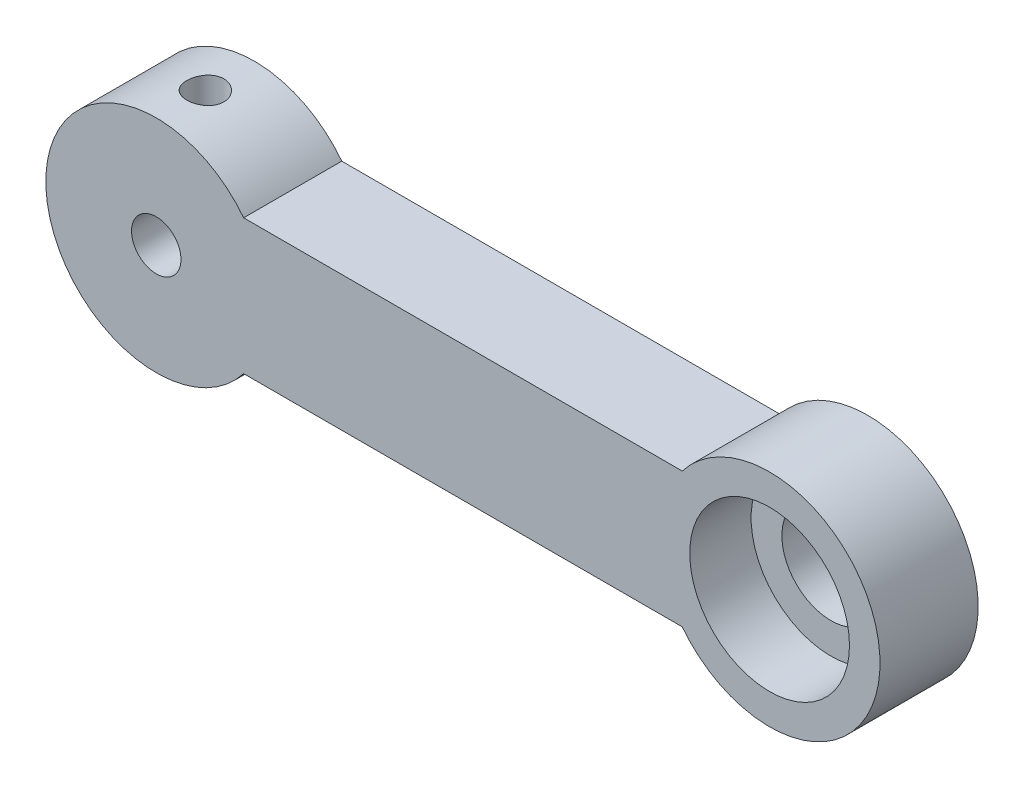
ISO-10303-21;
HEADER;
FILE_DESCRIPTION(('STEP AP214'),'2;1');
FILE_NAME('part.step','',(''),(''),'','','');
FILE_SCHEMA(('AUTOMOTIVE_DESIGN { 1 0 10303 214 1 1 1 1 }'));
ENDSEC;
DATA;
#1=APPLICATION_CONTEXT('core data for automotive mechanical design processes');
#2=APPLICATION_PROTOCOL_DEFINITION('international standard','automotive_design',2000,#1);
#3=PRODUCT_CONTEXT('',#1,'mechanical');
#4=PRODUCT('Part','Part','',(#3));
#5=PRODUCT_RELATED_PRODUCT_CATEGORY('part','',(#4));
#6=PRODUCT_DEFINITION_FORMATION('','',#4);
#7=PRODUCT_DEFINITION_CONTEXT('part definition',#1,'design');
#8=PRODUCT_DEFINITION('design','',#6,#7);
#9=PRODUCT_DEFINITION_SHAPE('','',#8);
#10=(LENGTH_UNIT() NAMED_UNIT(*) SI_UNIT(.MILLI.,.METRE.));
#11=(NAMED_UNIT(*) PLANE_ANGLE_UNIT() SI_UNIT($,.RADIAN.));
#12=(NAMED_UNIT(*) SI_UNIT($,.STERADIAN.) SOLID_ANGLE_UNIT());
#13=UNCERTAINTY_MEASURE_WITH_UNIT(LENGTH_MEASURE(1.E-05),#10,'distance_accuracy_value','');
#14=(GEOMETRIC_REPRESENTATION_CONTEXT(3) GLOBAL_UNCERTAINTY_ASSIGNED_CONTEXT((#13)) GLOBAL_UNIT_ASSIGNED_CONTEXT((#10,
#11,#12)) REPRESENTATION_CONTEXT('',''));
#15=CARTESIAN_POINT('',(0.,0.,0.));
#16=DIRECTION('',(0.,0.,1.));
#17=DIRECTION('',(1.,0.,0.));
#18=AXIS2_PLACEMENT_3D('',#15,#16,#17);
#19=CARTESIAN_POINT('',(47.1239034243875,5.5,0.));
#20=DIRECTION('',(0.,0.,1.));
#21=DIRECTION('',(1.,0.,0.));
#22=AXIS2_PLACEMENT_3D('',#19,#20,#21);
#23=CYLINDRICAL_SURFACE('',#22,4.);
#24=CARTESIAN_POINT('',(47.1239034243875,5.5,0.));
#25=DIRECTION('',(0.,0.,1.));
#26=DIRECTION('',(1.,0.,0.));
#27=AXIS2_PLACEMENT_3D('',#24,#25,#26);
#28=CIRCLE('',#27,4.);
#29=CARTESIAN_POINT('',(51.1239034243875,5.5,0.));
#30=VERTEX_POINT('',#29);
#31=EDGE_CURVE('E114',#30,#30,#28,.T.);
#32=ORIENTED_EDGE('',*,*,#31,.F.);
#33=EDGE_LOOP('',(#32));
#34=FACE_BOUND('',#33,.T.);
#35=CARTESIAN_POINT('',(47.1239034243875,5.5,3.));
#36=DIRECTION('',(0.,0.,1.));
#37=DIRECTION('',(1.,0.,0.));
#38=AXIS2_PLACEMENT_3D('',#35,#36,#37);
#39=CIRCLE('',#38,4.);
#40=CARTESIAN_POINT('',(51.1239034243875,5.5,3.));
#41=VERTEX_POINT('',#40);
#42=EDGE_CURVE('E112',#41,#41,#39,.F.);
#43=ORIENTED_EDGE('',*,*,#42,.F.);
#44=EDGE_LOOP('',(#43));
#45=FACE_BOUND('',#44,.T.);
#46=ADVANCED_FACE('F34',(#34,#45),#23,.F.);
#47=CARTESIAN_POINT('',(0.,0.,8.));
#48=DIRECTION('',(0.,1.,0.));
#49=DIRECTION('',(0.,0.,1.));
#50=AXIS2_PLACEMENT_3D('',#47,#48,#49);
#51=PLANE('',#50);
#52=DIRECTION('',(1.,0.,0.));
#53=VECTOR('',#52,1.);
#54=CARTESIAN_POINT('',(0.,0.,8.));
#55=LINE('',#54,#53);
#56=CARTESIAN_POINT('',(4.24780684877501,0.,8.));
#57=VERTEX_POINT('',#56);
#58=CARTESIAN_POINT('',(40.,0.,8.));
#59=VERTEX_POINT('',#58);
#60=EDGE_CURVE('E103',#57,#59,#55,.T.);
#61=ORIENTED_EDGE('',*,*,#60,.F.);
#62=DIRECTION('',(0.,0.,1.));
#63=VECTOR('',#62,1.);
#64=CARTESIAN_POINT('',(4.24780684877501,0.,0.));
#65=LINE('',#64,#63);
#66=CARTESIAN_POINT('',(4.24780684877501,0.,0.));
#67=VERTEX_POINT('',#66);
#68=EDGE_CURVE('E76',#57,#67,#65,.F.);
#69=ORIENTED_EDGE('',*,*,#68,.T.);
#70=DIRECTION('',(1.,0.,0.));
#71=VECTOR('',#70,1.);
#72=CARTESIAN_POINT('',(0.,0.,0.));
#73=LINE('',#72,#71);
#74=CARTESIAN_POINT('',(40.,0.,0.));
#75=VERTEX_POINT('',#74);
#76=EDGE_CURVE('E69',#67,#75,#73,.T.);
#77=ORIENTED_EDGE('',*,*,#76,.T.);
#78=DIRECTION('',(0.,0.,-1.));
#79=VECTOR('',#78,1.);
#80=CARTESIAN_POINT('',(40.,0.,8.));
#81=LINE('',#80,#79);
#82=EDGE_CURVE('E11',#59,#75,#81,.T.);
#83=ORIENTED_EDGE('',*,*,#82,.F.);
#84=EDGE_LOOP('',(#61,#69,#77,#83));
#85=FACE_BOUND('',#84,.T.);
#86=ADVANCED_FACE('F36',(#85),#51,.F.);
#87=CARTESIAN_POINT('',(47.1239034243875,5.5,8.));
#88=DIRECTION('',(0.,0.,-1.));
#89=DIRECTION('',(-1.,0.,0.));
#90=AXIS2_PLACEMENT_3D('',#87,#88,#89);
#91=CYLINDRICAL_SURFACE('',#90,9.);
#92=CARTESIAN_POINT('',(47.1239034243875,5.5,0.));
#93=DIRECTION('',(0.,0.,1.));
#94=DIRECTION('',(-1.,0.,0.));
#95=AXIS2_PLACEMENT_3D('',#92,#93,#94);
#96=CIRCLE('',#95,9.);
#97=CARTESIAN_POINT('',(40.,11.,0.));
#98=VERTEX_POINT('',#97);
#99=EDGE_CURVE('E104',#75,#98,#96,.T.);
#100=ORIENTED_EDGE('',*,*,#99,.T.);
#101=DIRECTION('',(0.,0.,-1.));
#102=VECTOR('',#101,1.);
#103=CARTESIAN_POINT('',(40.,11.,8.));
#104=LINE('',#103,#102);
#105=CARTESIAN_POINT('',(40.,11.,8.));
#106=VERTEX_POINT('',#105);
#107=EDGE_CURVE('E49',#106,#98,#104,.T.);
#108=ORIENTED_EDGE('',*,*,#107,.F.);
#109=CARTESIAN_POINT('',(47.1239034243875,5.5,8.));
#110=DIRECTION('',(0.,0.,1.));
#111=DIRECTION('',(-1.,0.,0.));
#112=AXIS2_PLACEMENT_3D('',#109,#110,#111);
#113=CIRCLE('',#112,9.);
#114=EDGE_CURVE('E58',#59,#106,#113,.T.);
#115=ORIENTED_EDGE('',*,*,#114,.F.);
#116=ORIENTED_EDGE('',*,*,#82,.T.);
#117=EDGE_LOOP('',(#100,#108,#115,#116));
#118=FACE_BOUND('',#117,.T.);
#119=ADVANCED_FACE('F168',(#118),#91,.T.);
#120=CARTESIAN_POINT('',(0.,11.,8.));
#121=DIRECTION('',(0.,-1.,0.));
#122=DIRECTION('',(0.,0.,-1.));
#123=AXIS2_PLACEMENT_3D('',#120,#121,#122);
#124=PLANE('',#123);
#125=DIRECTION('',(-1.,0.,0.));
#126=VECTOR('',#125,1.);
#127=CARTESIAN_POINT('',(0.,11.,0.));
#128=LINE('',#127,#126);
#129=CARTESIAN_POINT('',(4.24780684877501,11.,0.));
#130=VERTEX_POINT('',#129);
#131=EDGE_CURVE('E99',#98,#130,#128,.T.);
#132=ORIENTED_EDGE('',*,*,#131,.T.);
#133=DIRECTION('',(0.,0.,1.));
#134=VECTOR('',#133,1.);
#135=CARTESIAN_POINT('',(4.24780684877501,11.,0.));
#136=LINE('',#135,#134);
#137=CARTESIAN_POINT('',(4.24780684877501,11.,8.));
#138=VERTEX_POINT('',#137);
#139=EDGE_CURVE('E85',#130,#138,#136,.T.);
#140=ORIENTED_EDGE('',*,*,#139,.T.);
#141=DIRECTION('',(-1.,0.,0.));
#142=VECTOR('',#141,1.);
#143=CARTESIAN_POINT('',(0.,11.,8.));
#144=LINE('',#143,#142);
#145=EDGE_CURVE('E110',#106,#138,#144,.T.);
#146=ORIENTED_EDGE('',*,*,#145,.F.);
#147=ORIENTED_EDGE('',*,*,#107,.T.);
#148=EDGE_LOOP('',(#132,#140,#146,#147));
#149=FACE_BOUND('',#148,.T.);
#150=ADVANCED_FACE('F102',(#149),#124,.F.);
#151=CARTESIAN_POINT('',(47.1239034243875,5.5,8.));
#152=DIRECTION('',(0.,0.,-1.));
#153=DIRECTION('',(-1.,0.,0.));
#154=AXIS2_PLACEMENT_3D('',#151,#152,#153);
#155=PLANE('',#154);
#156=CARTESIAN_POINT('',(-2.8760965756125,5.5,8.));
#157=DIRECTION('',(0.,0.,1.));
#158=DIRECTION('',(1.,0.,0.));
#159=AXIS2_PLACEMENT_3D('',#156,#157,#158);
#160=CIRCLE('',#159,2.015);
#161=CARTESIAN_POINT('',(-0.861096575612496,5.5,8.));
#162=VERTEX_POINT('',#161);
#163=EDGE_CURVE('E179',#162,#162,#160,.T.);
#164=ORIENTED_EDGE('',*,*,#163,.F.);
#165=EDGE_LOOP('',(#164));
#166=FACE_BOUND('',#165,.T.);
#167=CARTESIAN_POINT('',(-2.8760965756125,5.5,8.));
#168=DIRECTION('',(0.,0.,1.));
#169=DIRECTION('',(1.,0.,0.));
#170=AXIS2_PLACEMENT_3D('',#167,#168,#169);
#171=CIRCLE('',#170,9.);
#172=EDGE_CURVE('E89',#138,#57,#171,.T.);
#173=ORIENTED_EDGE('',*,*,#172,.T.);
#174=ORIENTED_EDGE('',*,*,#60,.T.);
#175=ORIENTED_EDGE('',*,*,#114,.T.);
#176=ORIENTED_EDGE('',*,*,#145,.T.);
#177=EDGE_LOOP('',(#173,#174,#175,#176));
#178=FACE_BOUND('',#177,.T.);
#179=CARTESIAN_POINT('',(47.1239034243875,5.5,8.));
#180=DIRECTION('',(0.,0.,1.));
#181=DIRECTION('',(1.,0.,0.));
#182=AXIS2_PLACEMENT_3D('',#179,#180,#181);
#183=CIRCLE('',#182,6.50999999999999);
#184=CARTESIAN_POINT('',(53.6339034243875,5.5,8.));
#185=VERTEX_POINT('',#184);
#186=EDGE_CURVE('E183',#185,#185,#183,.T.);
#187=ORIENTED_EDGE('',*,*,#186,.F.);
#188=EDGE_LOOP('',(#187));
#189=FACE_BOUND('',#188,.T.);
#190=ADVANCED_FACE('F160',(#166,#178,#189),#155,.F.);
#191=CARTESIAN_POINT('',(47.1239034243875,5.5,0.));
#192=DIRECTION('',(0.,0.,-1.));
#193=DIRECTION('',(-1.,0.,0.));
#194=AXIS2_PLACEMENT_3D('',#191,#192,#193);
#195=PLANE('',#194);
#196=CARTESIAN_POINT('',(-2.8760965756125,5.5,0.));
#197=DIRECTION('',(0.,0.,1.));
#198=DIRECTION('',(1.,0.,0.));
#199=AXIS2_PLACEMENT_3D('',#196,#197,#198);
#200=CIRCLE('',#199,2.015);
#201=CARTESIAN_POINT('',(-0.861096575612496,5.5,0.));
#202=VERTEX_POINT('',#201);
#203=EDGE_CURVE('E176',#202,#202,#200,.T.);
#204=ORIENTED_EDGE('',*,*,#203,.T.);
#205=EDGE_LOOP('',(#204));
#206=FACE_BOUND('',#205,.T.);
#207=ORIENTED_EDGE('',*,*,#76,.F.);
#208=CARTESIAN_POINT('',(-2.8760965756125,5.5,0.));
#209=DIRECTION('',(0.,0.,1.));
#210=DIRECTION('',(1.,0.,0.));
#211=AXIS2_PLACEMENT_3D('',#208,#209,#210);
#212=CIRCLE('',#211,9.);
#213=EDGE_CURVE('E88',#130,#67,#212,.T.);
#214=ORIENTED_EDGE('',*,*,#213,.F.);
#215=ORIENTED_EDGE('',*,*,#131,.F.);
#216=ORIENTED_EDGE('',*,*,#99,.F.);
#217=EDGE_LOOP('',(#207,#214,#215,#216));
#218=FACE_BOUND('',#217,.T.);
#219=ORIENTED_EDGE('',*,*,#31,.T.);
#220=EDGE_LOOP('',(#219));
#221=FACE_BOUND('',#220,.T.);
#222=ADVANCED_FACE('F96',(#206,#218,#221),#195,.T.);
#223=CARTESIAN_POINT('',(47.1239034243875,5.5,3.));
#224=DIRECTION('',(0.,0.,1.));
#225=DIRECTION('',(1.,0.,0.));
#226=AXIS2_PLACEMENT_3D('',#223,#224,#225);
#227=PLANE('',#226);
#228=CARTESIAN_POINT('',(47.1239034243875,5.5,3.));
#229=DIRECTION('',(0.,0.,1.));
#230=DIRECTION('',(1.,0.,0.));
#231=AXIS2_PLACEMENT_3D('',#228,#229,#230);
#232=CIRCLE('',#231,6.50999999999999);
#233=CARTESIAN_POINT('',(53.6339034243875,5.5,3.));
#234=VERTEX_POINT('',#233);
#235=EDGE_CURVE('E115',#234,#234,#232,.T.);
#236=ORIENTED_EDGE('',*,*,#235,.T.);
#237=EDGE_LOOP('',(#236));
#238=FACE_BOUND('',#237,.T.);
#239=ORIENTED_EDGE('',*,*,#42,.T.);
#240=EDGE_LOOP('',(#239));
#241=FACE_BOUND('',#240,.T.);
#242=ADVANCED_FACE('F149',(#238,#241),#227,.T.);
#243=CARTESIAN_POINT('',(47.1239034243875,5.5,3.));
#244=DIRECTION('',(0.,0.,1.));
#245=DIRECTION('',(1.,0.,0.));
#246=AXIS2_PLACEMENT_3D('',#243,#244,#245);
#247=CYLINDRICAL_SURFACE('',#246,6.50999999999999);
#248=ORIENTED_EDGE('',*,*,#235,.F.);
#249=EDGE_LOOP('',(#248));
#250=FACE_BOUND('',#249,.T.);
#251=ORIENTED_EDGE('',*,*,#186,.T.);
#252=EDGE_LOOP('',(#251));
#253=FACE_BOUND('',#252,.T.);
#254=ADVANCED_FACE('F147',(#250,#253),#247,.F.);
#255=CARTESIAN_POINT('',(-2.8760965756125,5.5,0.));
#256=DIRECTION('',(0.,0.,1.));
#257=DIRECTION('',(1.,0.,0.));
#258=AXIS2_PLACEMENT_3D('',#255,#256,#257);
#259=CYLINDRICAL_SURFACE('',#258,9.);
#260=CARTESIAN_POINT('',(-2.8760965756125,-3.5,5.51));
#261=CARTESIAN_POINT('',(-2.96028040690752,-3.49999855218498,5.50999663191623));
#262=CARTESIAN_POINT('',(-3.04450997600634,-3.49880654936634,5.50293623397101));
#263=CARTESIAN_POINT('',(-3.21060617309282,-3.49416620365112,5.47489325685609));
#264=CARTESIAN_POINT('',(-3.29247056552096,-3.49071579456022,5.45389792850471));
#265=CARTESIAN_POINT('',(-3.45140935547466,-3.4819455929922,5.39863732254473));
#266=CARTESIAN_POINT('',(-3.5284876316704,-3.47662733811376,5.36438295732929));
#267=CARTESIAN_POINT('',(-3.67579299659992,-3.46470600022673,5.28360532789586));
#268=CARTESIAN_POINT('',(-3.74602085601205,-3.4581030619971,5.23708344597088));
#269=CARTESIAN_POINT('',(-3.87832154933646,-3.44427269148449,5.13261224998846));
#270=CARTESIAN_POINT('',(-3.94031843210536,-3.4370403429084,5.07456739321781));
#271=CARTESIAN_POINT('',(-4.05374118942527,-3.422803853935,4.94890356762904));
#272=CARTESIAN_POINT('',(-4.10516639221043,-3.41579972806365,4.88128399085659));
#273=CARTESIAN_POINT('',(-4.19629097049418,-3.40276508956071,4.73786771533586));
#274=CARTESIAN_POINT('',(-4.23591513340478,-3.39674092852148,4.66202259995039));
#275=CARTESIAN_POINT('',(-4.30183184754516,-3.38641654901985,4.50463495986804));
#276=CARTESIAN_POINT('',(-4.32812531168406,-3.38211621251121,4.42309282574801));
#277=CARTESIAN_POINT('',(-4.36639473171205,-3.37577534084285,4.25743130673641));
#278=CARTESIAN_POINT('',(-4.37850187787853,-3.3737141123528,4.17334303514304));
#279=CARTESIAN_POINT('',(-4.38846176312593,-3.37202224638639,4.00430519619741));
#280=CARTESIAN_POINT('',(-4.38631552447238,-3.37239143459835,3.91935569104991));
#281=CARTESIAN_POINT('',(-4.36793639837256,-3.37549979815238,3.75194400042342));
#282=CARTESIAN_POINT('',(-4.35185097575971,-3.37821416260982,3.66946509789419));
#283=CARTESIAN_POINT('',(-4.30628155191977,-3.38566819322774,3.50839358796051));
#284=CARTESIAN_POINT('',(-4.276797085552,-3.39040792969757,3.42980111557645));
#285=CARTESIAN_POINT('',(-4.20511728957096,-3.40140541255161,3.27829245981058));
#286=CARTESIAN_POINT('',(-4.16286081039339,-3.40767043294621,3.20540575641593));
#287=CARTESIAN_POINT('',(-4.06687990235038,-3.42100753497343,3.06770163528141));
#288=CARTESIAN_POINT('',(-4.01315453579976,-3.42807968257399,3.00288487801899));
#289=CARTESIAN_POINT('',(-3.89495788250733,-3.44234315682377,2.88230704395312));
#290=CARTESIAN_POINT('',(-3.8303600927499,-3.44953486464518,2.82666994252046));
#291=CARTESIAN_POINT('',(-3.69267989849588,-3.46314504293981,2.72700598467358));
#292=CARTESIAN_POINT('',(-3.61959743797023,-3.4695635083063,2.68297920493515));
#293=CARTESIAN_POINT('',(-3.46690523254514,-3.4809133126244,2.60777401586093));
#294=CARTESIAN_POINT('',(-3.38728994414748,-3.48584337162453,2.57660665655734));
#295=CARTESIAN_POINT('',(-3.22385360633593,-3.49365062052748,2.52812060812794));
#296=CARTESIAN_POINT('',(-3.14003291416142,-3.49652798448708,2.51080074479884));
#297=CARTESIAN_POINT('',(-2.97163358456211,-3.4998822115326,2.49066962673628));
#298=CARTESIAN_POINT('',(-2.88707583193853,-3.50038722922228,2.48768819575929));
#299=CARTESIAN_POINT('',(-2.71866906280707,-3.49901700836876,2.49586473720778));
#300=CARTESIAN_POINT('',(-2.63482001878016,-3.49714186267835,2.50702215806117));
#301=CARTESIAN_POINT('',(-2.47073718888595,-3.49123944723341,2.54301814534468));
#302=CARTESIAN_POINT('',(-2.39048438099822,-3.48722544994186,2.56777236686523));
#303=CARTESIAN_POINT('',(-2.23526789491027,-3.47749361149574,2.63016929067711));
#304=CARTESIAN_POINT('',(-2.16030451730714,-3.47177567360291,2.66781272474904));
#305=CARTESIAN_POINT('',(-2.01705629457658,-3.45920041893288,2.75530860845832));
#306=CARTESIAN_POINT('',(-1.94883717770084,-3.45233336911958,2.80526724244356));
#307=CARTESIAN_POINT('',(-1.82169009526839,-3.43825075635745,2.91582943641656));
#308=CARTESIAN_POINT('',(-1.76276281478915,-3.4310351677624,2.97643378060577));
#309=CARTESIAN_POINT('',(-1.65524052543818,-3.41697756225923,3.10733066728689));
#310=CARTESIAN_POINT('',(-1.60676055538153,-3.41014026578846,3.17771829294824));
#311=CARTESIAN_POINT('',(-1.52231275614601,-3.39770189190615,3.32573825407895));
#312=CARTESIAN_POINT('',(-1.48634452651698,-3.3921007749316,3.40337035758103));
#313=CARTESIAN_POINT('',(-1.42811281470965,-3.3828044410498,3.56335542604624));
#314=CARTESIAN_POINT('',(-1.40579230191997,-3.37910130358221,3.64568715180104));
#315=CARTESIAN_POINT('',(-1.37531032750289,-3.37400042905291,3.81299860350929));
#316=CARTESIAN_POINT('',(-1.36714761681589,-3.37260248861777,3.89797809519249));
#317=CARTESIAN_POINT('',(-1.36524814443519,-3.37227913249936,4.06702390275659));
#318=CARTESIAN_POINT('',(-1.3713302874316,-3.37332267794466,4.15108817922104));
#319=CARTESIAN_POINT('',(-1.39735603791239,-3.37769664587433,4.31697914491591));
#320=CARTESIAN_POINT('',(-1.41729959872844,-3.3810270606593,4.39880584167881));
#321=CARTESIAN_POINT('',(-1.47041232278205,-3.38958765295106,4.55782746974423));
#322=CARTESIAN_POINT('',(-1.50356569012189,-3.3948155608288,4.63502780672988));
#323=CARTESIAN_POINT('',(-1.58213826198711,-3.40658425377943,4.78279988065248));
#324=CARTESIAN_POINT('',(-1.62755808820679,-3.41312510539123,4.85337128137422));
#325=CARTESIAN_POINT('',(-1.73001973873243,-3.42688099470917,4.98679677043307));
#326=CARTESIAN_POINT('',(-1.78719472112584,-3.4341031922828,5.04954787908375));
#327=CARTESIAN_POINT('',(-1.9112630833793,-3.44835108899346,5.16462716497614));
#328=CARTESIAN_POINT('',(-1.97815870215674,-3.45537674241544,5.21695293438751));
#329=CARTESIAN_POINT('',(-2.12032684002082,-3.46849703889302,5.31003173497558));
#330=CARTESIAN_POINT('',(-2.19565477746841,-3.47458481260152,5.35070109718076));
#331=CARTESIAN_POINT('',(-2.35214504891661,-3.48507656422292,5.41874591280365));
#332=CARTESIAN_POINT('',(-2.43330149633898,-3.48948221337872,5.44613456836016));
#333=CARTESIAN_POINT('',(-2.57499072999182,-3.49515508831471,5.48091509482011));
#334=CARTESIAN_POINT('',(-2.63466774940342,-3.4969621913707,5.49180440771002));
#335=CARTESIAN_POINT('',(-2.75492081476759,-3.4993851578433,5.50634800893813));
#336=CARTESIAN_POINT('',(-2.81549684489056,-3.50000104220964,5.51000242451509));
#337=CARTESIAN_POINT('',(-2.8760965756125,-3.5,5.51));
#338=B_SPLINE_CURVE_WITH_KNOTS('',3,(#260,#261,#262,#263,#264,#265,#266,#267,#268,#269,#270,
#271,#272,#273,#274,#275,#276,#277,#278,#279,#280,#281,#282,#283,#284,#285,#286,#287,#288,#289,
#290,#291,#292,#293,#294,#295,#296,#297,#298,#299,#300,#301,#302,#303,#304,#305,#306,#307,#308,
#309,#310,#311,#312,#313,#314,#315,#316,#317,#318,#319,#320,#321,#322,#323,#324,#325,#326,#327,
#328,#329,#330,#331,#332,#333,#334,#335,#336,#337),.UNSPECIFIED.,.T.,.F.,(4,2,2,2,2,2,2,2,2,2,2,
2,2,2,2,2,2,2,2,2,2,2,2,2,2,2,2,2,2,2,2,2,2,2,2,2,2,2,4),(0.,0.252329978845575,
0.504891135268154,0.757244870392844,1.00957018266176,1.26408229715819,1.51861057935301,
1.77472796287162,2.03082780466287,2.28454014742669,2.53823429391067,2.78927688813311,
3.04032819783142,3.29260105521894,3.54489454609687,3.80035710173568,4.05582134443396,
4.31150465130647,4.56716627512321,4.81978595242411,5.07239577505792,5.32345599847534,
5.57453047811445,5.82785052881584,6.08118924781839,6.33718918891409,6.59318093573418,
6.8480955087645,7.1029875910375,7.35465684310833,7.60632524786844,7.8576936137854,
8.10907472206119,8.36347800289646,8.61793997262826,8.87418515798765,9.13017508919799,
9.3118180183109,9.49345775287616),.UNSPECIFIED.);
#339=CARTESIAN_POINT('',(-2.8760965756125,-3.5,5.51));
#340=VERTEX_POINT('',#339);
#341=EDGE_CURVE('E139',#340,#340,#338,.T.);
#342=ORIENTED_EDGE('',*,*,#341,.F.);
#343=EDGE_LOOP('',(#342));
#344=FACE_BOUND('',#343,.T.);
#345=CARTESIAN_POINT('',(-2.8760965756125,14.5,5.51));
#346=CARTESIAN_POINT('',(-2.79191274431748,14.499998552185,5.50999663191623));
#347=CARTESIAN_POINT('',(-2.70768317521865,14.4988065493663,5.50293623397101));
#348=CARTESIAN_POINT('',(-2.54158697813218,14.4941662036511,5.47489325685609));
#349=CARTESIAN_POINT('',(-2.45972258570404,14.4907157945602,5.45389792850471));
#350=CARTESIAN_POINT('',(-2.30078379575033,14.4819455929922,5.39863732254473));
#351=CARTESIAN_POINT('',(-2.22370551955459,14.4766273381138,5.36438295732929));
#352=CARTESIAN_POINT('',(-2.07640015462508,14.4647060002267,5.28360532789586));
#353=CARTESIAN_POINT('',(-2.00617229521294,14.4581030619971,5.23708344597088));
#354=CARTESIAN_POINT('',(-1.87387160188853,14.4442726914845,5.13261224998846));
#355=CARTESIAN_POINT('',(-1.81187471911963,14.4370403429084,5.07456739321781));
#356=CARTESIAN_POINT('',(-1.69845196179973,14.422803853935,4.94890356762904));
#357=CARTESIAN_POINT('',(-1.64702675901457,14.4157997280636,4.88128399085659));
#358=CARTESIAN_POINT('',(-1.55590218073081,14.4027650895607,4.73786771533586));
#359=CARTESIAN_POINT('',(-1.51627801782022,14.3967409285215,4.66202259995039));
#360=CARTESIAN_POINT('',(-1.45036130367983,14.3864165490198,4.50463495986803));
#361=CARTESIAN_POINT('',(-1.42406783954094,14.3821162125112,4.42309282574801));
#362=CARTESIAN_POINT('',(-1.38579841951294,14.3757753408429,4.25743130673641));
#363=CARTESIAN_POINT('',(-1.37369127334647,14.3737141123528,4.17334303514304));
#364=CARTESIAN_POINT('',(-1.36373138809906,14.3720222463864,4.00430519619741));
#365=CARTESIAN_POINT('',(-1.36587762675262,14.3723914345983,3.91935569104991));
#366=CARTESIAN_POINT('',(-1.38425675285244,14.3754997981524,3.75194400042342));
#367=CARTESIAN_POINT('',(-1.40034217546528,14.3782141626098,3.66946509789419));
#368=CARTESIAN_POINT('',(-1.44591159930522,14.3856681932277,3.50839358796051));
#369=CARTESIAN_POINT('',(-1.475396065673,14.3904079296976,3.42980111557645));
#370=CARTESIAN_POINT('',(-1.54707586165403,14.4014054125516,3.27829245981058));
#371=CARTESIAN_POINT('',(-1.5893323408316,14.4076704329462,3.20540575641593));
#372=CARTESIAN_POINT('',(-1.68531324887462,14.4210075349734,3.06770163528141));
#373=CARTESIAN_POINT('',(-1.73903861542524,14.428079682574,3.00288487801899));
#374=CARTESIAN_POINT('',(-1.85723526871766,14.4423431568238,2.88230704395312));
#375=CARTESIAN_POINT('',(-1.92183305847509,14.4495348646452,2.82666994252046));
#376=CARTESIAN_POINT('',(-2.05951325272911,14.4631450429398,2.72700598467358));
#377=CARTESIAN_POINT('',(-2.13259571325477,14.4695635083063,2.68297920493515));
#378=CARTESIAN_POINT('',(-2.28528791867985,14.4809133126244,2.60777401586093));
#379=CARTESIAN_POINT('',(-2.36490320707751,14.4858433716245,2.57660665655734));
#380=CARTESIAN_POINT('',(-2.52833954488907,14.4936506205275,2.52812060812794));
#381=CARTESIAN_POINT('',(-2.61216023706357,14.4965279844871,2.51080074479884));
#382=CARTESIAN_POINT('',(-2.78055956666288,14.4998822115326,2.49066962673628));
#383=CARTESIAN_POINT('',(-2.86511731928647,14.5003872292223,2.48768819575929));
#384=CARTESIAN_POINT('',(-3.03352408841792,14.4990170083688,2.49586473720778));
#385=CARTESIAN_POINT('',(-3.11737313244483,14.4971418626783,2.50702215806117));
#386=CARTESIAN_POINT('',(-3.28145596233904,14.4912394472334,2.54301814534468));
#387=CARTESIAN_POINT('',(-3.36170877022677,14.4872254499419,2.56777236686523));
#388=CARTESIAN_POINT('',(-3.51692525631472,14.4774936114957,2.63016929067711));
#389=CARTESIAN_POINT('',(-3.59188863391786,14.4717756736029,2.66781272474904));
#390=CARTESIAN_POINT('',(-3.73513685664842,14.4592004189329,2.75530860845832));
#391=CARTESIAN_POINT('',(-3.80335597352415,14.4523333691196,2.80526724244356));
#392=CARTESIAN_POINT('',(-3.93050305595661,14.4382507563574,2.91582943641656));
#393=CARTESIAN_POINT('',(-3.98943033643584,14.4310351677624,2.97643378060577));
#394=CARTESIAN_POINT('',(-4.09695262578682,14.4169775622592,3.1073306672869));
#395=CARTESIAN_POINT('',(-4.14543259584346,14.4101402657885,3.17771829294824));
#396=CARTESIAN_POINT('',(-4.22988039507899,14.3977018919061,3.32573825407895));
#397=CARTESIAN_POINT('',(-4.26584862470802,14.3921007749316,3.40337035758103));
#398=CARTESIAN_POINT('',(-4.32408033651535,14.3828044410498,3.56335542604624));
#399=CARTESIAN_POINT('',(-4.34640084930502,14.3791013035822,3.64568715180104));
#400=CARTESIAN_POINT('',(-4.3768828237221,14.3740004290529,3.81299860350929));
#401=CARTESIAN_POINT('',(-4.3850455344091,14.3726024886178,3.89797809519249));
#402=CARTESIAN_POINT('',(-4.38694500678981,14.3722791324994,4.06702390275659));
#403=CARTESIAN_POINT('',(-4.38086286379339,14.3733226779447,4.15108817922104));
#404=CARTESIAN_POINT('',(-4.3548371133126,14.3776966458743,4.31697914491591));
#405=CARTESIAN_POINT('',(-4.33489355249656,14.3810270606593,4.39880584167881));
#406=CARTESIAN_POINT('',(-4.28178082844294,14.3895876529511,4.55782746974423));
#407=CARTESIAN_POINT('',(-4.2486274611031,14.3948155608288,4.63502780672988));
#408=CARTESIAN_POINT('',(-4.17005488923789,14.4065842537794,4.78279988065248));
#409=CARTESIAN_POINT('',(-4.1246350630182,14.4131251053912,4.85337128137422));
#410=CARTESIAN_POINT('',(-4.02217341249256,14.4268809947092,4.98679677043307));
#411=CARTESIAN_POINT('',(-3.96499843009915,14.4341031922828,5.04954787908375));
#412=CARTESIAN_POINT('',(-3.84093006784569,14.4483510889935,5.16462716497614));
#413=CARTESIAN_POINT('',(-3.77403444906825,14.4553767424154,5.21695293438751));
#414=CARTESIAN_POINT('',(-3.63186631120417,14.468497038893,5.31003173497558));
#415=CARTESIAN_POINT('',(-3.55653837375658,14.4745848126015,5.35070109718076));
#416=CARTESIAN_POINT('',(-3.40004810230838,14.4850765642229,5.41874591280365));
#417=CARTESIAN_POINT('',(-3.31889165488601,14.4894822133787,5.44613456836016));
#418=CARTESIAN_POINT('',(-3.17720242123318,14.4951550883147,5.48091509482011));
#419=CARTESIAN_POINT('',(-3.11752540182158,14.4969621913707,5.49180440771002));
#420=CARTESIAN_POINT('',(-2.99727233645741,14.4993851578433,5.50634800893813));
#421=CARTESIAN_POINT('',(-2.93669630633444,14.5000010422096,5.51000242451509));
#422=CARTESIAN_POINT('',(-2.8760965756125,14.5,5.51));
#423=B_SPLINE_CURVE_WITH_KNOTS('',3,(#345,#346,#347,#348,#349,#350,#351,#352,#353,#354,#355,
#356,#357,#358,#359,#360,#361,#362,#363,#364,#365,#366,#367,#368,#369,#370,#371,#372,#373,#374,
#375,#376,#377,#378,#379,#380,#381,#382,#383,#384,#385,#386,#387,#388,#389,#390,#391,#392,#393,
#394,#395,#396,#397,#398,#399,#400,#401,#402,#403,#404,#405,#406,#407,#408,#409,#410,#411,#412,
#413,#414,#415,#416,#417,#418,#419,#420,#421,#422),.UNSPECIFIED.,.T.,.F.,(4,2,2,2,2,2,2,2,2,2,2,
2,2,2,2,2,2,2,2,2,2,2,2,2,2,2,2,2,2,2,2,2,2,2,2,2,2,2,4),(0.,0.252329978845575,
0.504891135268154,0.757244870392843,1.00957018266176,1.26408229715819,1.51861057935301,
1.77472796287162,2.03082780466287,2.28454014742669,2.53823429391067,2.78927688813312,
3.04032819783142,3.29260105521894,3.54489454609687,3.80035710173568,4.05582134443396,
4.31150465130647,4.56716627512321,4.81978595242411,5.07239577505792,5.32345599847534,
5.57453047811445,5.82785052881584,6.08118924781839,6.33718918891409,6.59318093573418,
6.8480955087645,7.1029875910375,7.35465684310833,7.60632524786844,7.8576936137854,
8.10907472206118,8.36347800289646,8.61793997262826,8.87418515798765,9.13017508919799,
9.3118180183109,9.49345775287616),.UNSPECIFIED.);
#424=CARTESIAN_POINT('',(-2.8760965756125,14.5,5.51));
#425=VERTEX_POINT('',#424);
#426=EDGE_CURVE('E134',#425,#425,#423,.T.);
#427=ORIENTED_EDGE('',*,*,#426,.F.);
#428=EDGE_LOOP('',(#427));
#429=FACE_BOUND('',#428,.T.);
#430=ORIENTED_EDGE('',*,*,#68,.F.);
#431=ORIENTED_EDGE('',*,*,#172,.F.);
#432=ORIENTED_EDGE('',*,*,#139,.F.);
#433=ORIENTED_EDGE('',*,*,#213,.T.);
#434=EDGE_LOOP('',(#430,#431,#432,#433));
#435=FACE_BOUND('',#434,.T.);
#436=ADVANCED_FACE('F87',(#344,#429,#435),#259,.T.);
#437=CARTESIAN_POINT('',(-2.8760965756125,5.5,0.));
#438=DIRECTION('',(0.,0.,1.));
#439=DIRECTION('',(1.,0.,0.));
#440=AXIS2_PLACEMENT_3D('',#437,#438,#439);
#441=CYLINDRICAL_SURFACE('',#440,2.015);
#442=CARTESIAN_POINT('',(-2.8760965756125,3.485,5.51));
#443=CARTESIAN_POINT('',(-2.94981877839655,3.48500453270231,5.5099952748457));
#444=CARTESIAN_POINT('',(-3.02366296587819,3.48908881021909,5.50455689250233));
#445=CARTESIAN_POINT('',(-3.16903197866385,3.50505818411579,5.48314427925186));
#446=CARTESIAN_POINT('',(-3.2405504186939,3.51696311926791,5.46714325343478));
#447=CARTESIAN_POINT('',(-3.37876651389527,3.54743063600791,5.42569212475195));
#448=CARTESIAN_POINT('',(-3.44549061229833,3.56595268313948,5.40029951921727));
#449=CARTESIAN_POINT('',(-3.57328635760845,3.60825780009532,5.34126306920476));
#450=CARTESIAN_POINT('',(-3.63435969780273,3.63203928660447,5.30762170762301));
#451=CARTESIAN_POINT('',(-3.75557472333833,3.68574158309985,5.22974793209113));
#452=CARTESIAN_POINT('',(-3.81510687180643,3.71602691382946,5.18482340424334));
#453=CARTESIAN_POINT('',(-3.9262953284408,3.77912681519936,5.0874986203906));
#454=CARTESIAN_POINT('',(-3.97793919050005,3.81194526225709,5.03508679800324));
#455=CARTESIAN_POINT('',(-4.08267812541831,3.88469102070199,4.91216872811545));
#456=CARTESIAN_POINT('',(-4.13394149040611,3.92470961737011,4.84014884338168));
#457=CARTESIAN_POINT('',(-4.22382467267523,4.00089786992663,4.68673992848707));
#458=CARTESIAN_POINT('',(-4.26246184738462,4.03707276322258,4.60536397022676));
#459=CARTESIAN_POINT('',(-4.31457419235912,4.08866556173801,4.46311947345218));
#460=CARTESIAN_POINT('',(-4.33213394551666,4.10694609259209,4.4048000813832));
#461=CARTESIAN_POINT('',(-4.36024455107795,4.13693161010392,4.2849173933223));
#462=CARTESIAN_POINT('',(-4.37081142922518,4.14865162208795,4.22336186588767));
#463=CARTESIAN_POINT('',(-4.38425882864965,4.16366735474794,4.09777551177588));
#464=CARTESIAN_POINT('',(-4.38706986125597,4.16688690438219,4.03372748821921));
#465=CARTESIAN_POINT('',(-4.38452163291725,4.16400582069103,3.90599276277303));
#466=CARTESIAN_POINT('',(-4.37915938350202,4.15790177829557,3.8423062015953));
#467=CARTESIAN_POINT('',(-4.36175523782015,4.13868392616926,3.72412039811408));
#468=CARTESIAN_POINT('',(-4.35048396725514,4.12638421519747,3.66936417524714));
#469=CARTESIAN_POINT('',(-4.32243163715208,4.09687662657598,3.56266423820703));
#470=CARTESIAN_POINT('',(-4.30564530011924,4.07966404977009,3.51072327370012));
#471=CARTESIAN_POINT('',(-4.25506966360861,4.03011531079342,3.37853458817305));
#472=CARTESIAN_POINT('',(-4.21720887295705,3.99504767353766,3.30086797729938));
#473=CARTESIAN_POINT('',(-4.12983667111887,3.92150601643927,3.15409443595959));
#474=CARTESIAN_POINT('',(-4.0802969998483,3.88302387744317,3.08500889871141));
#475=CARTESIAN_POINT('',(-3.9688321187813,3.80563376364407,2.95425418544888));
#476=CARTESIAN_POINT('',(-3.90662879856987,3.76673910888505,2.89281297664221));
#477=CARTESIAN_POINT('',(-3.77116118174806,3.69306641702855,2.7807139543781));
#478=CARTESIAN_POINT('',(-3.69791855374165,3.65828054842735,2.73003547457837));
#479=CARTESIAN_POINT('',(-3.55701436696585,3.60234005904105,2.65032680902004));
#480=CARTESIAN_POINT('',(-3.49119080870873,3.57985095199429,2.61899273898357));
#481=CARTESIAN_POINT('',(-3.35406104550711,3.54121585863354,2.56575901524398));
#482=CARTESIAN_POINT('',(-3.28275831644036,3.52506588997536,2.54385343757909));
#483=CARTESIAN_POINT('',(-3.13593753525172,3.50043108726051,2.51061192655081));
#484=CARTESIAN_POINT('',(-3.06039649133854,3.49199345054765,2.49934106132168));
#485=CARTESIAN_POINT('',(-2.90801553098086,3.48381105123076,2.48840904755759));
#486=CARTESIAN_POINT('',(-2.83117616804237,3.48406267319933,2.48874307046028));
#487=CARTESIAN_POINT('',(-2.68661978366418,3.49275284338497,2.50035771120156));
#488=CARTESIAN_POINT('',(-2.61875937629929,3.50036958372494,2.5105395283968));
#489=CARTESIAN_POINT('',(-2.48601642216635,3.52197397404152,2.53967221271149));
#490=CARTESIAN_POINT('',(-2.4211345159321,3.53596298739108,2.55862495641907));
#491=CARTESIAN_POINT('',(-2.2934608866266,3.56990083059425,2.60521620885325));
#492=CARTESIAN_POINT('',(-2.23082738746545,3.59004526966489,2.63314163850519));
#493=CARTESIAN_POINT('',(-2.1111434774302,3.63474968886714,2.69633910394252));
#494=CARTESIAN_POINT('',(-2.05409383755472,3.65931027743978,2.73161215216239));
#495=CARTESIAN_POINT('',(-1.9370134945443,3.71583438329052,2.8150022903798));
#496=CARTESIAN_POINT('',(-1.87807840399816,3.74834909979095,2.86428076266581));
#497=CARTESIAN_POINT('',(-1.76873737632182,3.81533220499886,2.97058964106681));
#498=CARTESIAN_POINT('',(-1.71835100544906,3.84980484074646,3.02763730574401));
#499=CARTESIAN_POINT('',(-1.61781461898497,3.92469940023627,3.16034024056558));
#500=CARTESIAN_POINT('',(-1.56951804949924,3.9650110619001,3.23747316982411));
#501=CARTESIAN_POINT('',(-1.48675378617063,4.03950762215423,3.40149467582342));
#502=CARTESIAN_POINT('',(-1.45224444702638,4.07371079609393,3.48835284338936));
#503=CARTESIAN_POINT('',(-1.40963544559399,4.11787451555064,3.63536909511407));
#504=CARTESIAN_POINT('',(-1.39648443421799,4.13208963718853,3.69276749613689));
#505=CARTESIAN_POINT('',(-1.37693698609298,4.15353769989464,3.8099206961865));
#506=CARTESIAN_POINT('',(-1.37052555700594,4.16078613540519,3.86966995694616));
#507=CARTESIAN_POINT('',(-1.36491761799141,4.16711363633462,3.99025997456947));
#508=CARTESIAN_POINT('',(-1.36575685404584,4.16615222726012,4.0511046617306));
#509=CARTESIAN_POINT('',(-1.37466011517869,4.15614274537687,4.17161546902857));
#510=CARTESIAN_POINT('',(-1.3827335647699,4.14708412380412,4.23127994796121));
#511=CARTESIAN_POINT('',(-1.40803493397733,4.11962577022785,4.36078352767387));
#512=CARTESIAN_POINT('',(-1.42689526769473,4.09960065390719,4.42994669858926));
#513=CARTESIAN_POINT('',(-1.4732289128206,4.05318973554381,4.56308034170505));
#514=CARTESIAN_POINT('',(-1.50072394527347,4.02678793171494,4.62703720052376));
#515=CARTESIAN_POINT('',(-1.57420399971352,3.96101110522288,4.77053724101733));
#516=CARTESIAN_POINT('',(-1.62329592045463,3.92029764584113,4.84787335380277));
#517=CARTESIAN_POINT('',(-1.73433128265201,3.83825916432732,4.99235867453764));
#518=CARTESIAN_POINT('',(-1.79628595915904,3.79693363708294,5.0594988874525));
#519=CARTESIAN_POINT('',(-1.93310571288829,3.71749974081299,5.1829717666457));
#520=CARTESIAN_POINT('',(-2.00806895659668,3.67941937973438,5.23921482238808));
#521=CARTESIAN_POINT('',(-2.16965175997291,3.61087216916794,5.33788370312638));
#522=CARTESIAN_POINT('',(-2.25624277121553,3.58038717911713,5.38034252500275));
#523=CARTESIAN_POINT('',(-2.41193780933391,3.5380451343123,5.43854386418703));
#524=CARTESIAN_POINT('',(-2.47872405347893,3.52334702493812,5.45846963473485));
#525=CARTESIAN_POINT('',(-2.61541856698166,3.50074179911369,5.48896478498133));
#526=CARTESIAN_POINT('',(-2.68531746998576,3.492815589271,5.49956047348255));
#527=CARTESIAN_POINT('',(-2.77573173114834,3.48740028791519,5.50679552828423));
#528=CARTESIAN_POINT('',(-2.79577141584326,3.48650164230489,5.50799567320819));
#529=CARTESIAN_POINT('',(-2.83590323082275,3.48530083397244,5.50959861531265));
#530=CARTESIAN_POINT('',(-2.85599536878434,3.48499876410656,5.51000128836769));
#531=CARTESIAN_POINT('',(-2.8760965756125,3.485,5.51));
#532=B_SPLINE_CURVE_WITH_KNOTS('',3,(#442,#443,#444,#445,#446,#447,#448,#449,#450,#451,#452,
#453,#454,#455,#456,#457,#458,#459,#460,#461,#462,#463,#464,#465,#466,#467,#468,#469,#470,#471,
#472,#473,#474,#475,#476,#477,#478,#479,#480,#481,#482,#483,#484,#485,#486,#487,#488,#489,#490,
#491,#492,#493,#494,#495,#496,#497,#498,#499,#500,#501,#502,#503,#504,#505,#506,#507,#508,#509,
#510,#511,#512,#513,#514,#515,#516,#517,#518,#519,#520,#521,#522,#523,#524,#525,#526,#527,#528,
#529,#530,#531),.UNSPECIFIED.,.T.,.F.,(4,2,2,2,2,2,2,2,2,2,2,2,2,2,2,2,2,2,2,2,2,2,2,2,2,2,2,2,
2,2,2,2,2,2,2,2,2,2,2,2,2,2,2,2,4),(0.,0.221078354178145,0.442719697801299,0.663025978874245,
0.883266028439404,1.12389268474966,1.36489516393969,1.65479782275133,1.94430025454467,
2.13442641531428,2.32411533633045,2.5154983443949,2.7069513463285,2.87805320056293,
3.04931926534403,3.32754890436423,3.60645883061296,3.89232558450543,4.17763835883575,
4.40559465742992,4.63340752029297,4.86260537869988,5.0917078735944,5.29788345815509,
5.50410317552895,5.71771290731778,5.93135209206199,6.18070080677339,6.43061274776487,
6.72787355894454,7.0242295583594,7.20528458259616,7.38593598837276,7.5674785169263,
7.74925789796222,7.97132750786326,8.19396028184608,8.49318159052359,8.79266536375755,
9.09451608571596,9.39563881219736,9.60846274173454,9.8206846143953,9.88095479112539,
9.94123434809386),.UNSPECIFIED.);
#533=CARTESIAN_POINT('',(-2.8760965756125,3.485,5.51));
#534=VERTEX_POINT('',#533);
#535=EDGE_CURVE('E38',#534,#534,#532,.T.);
#536=ORIENTED_EDGE('',*,*,#535,.T.);
#537=EDGE_LOOP('',(#536));
#538=FACE_BOUND('',#537,.T.);
#539=CARTESIAN_POINT('',(-2.8760965756125,7.515,5.51));
#540=CARTESIAN_POINT('',(-2.80237437282844,7.51499546729769,5.5099952748457));
#541=CARTESIAN_POINT('',(-2.72853018534681,7.51091118978091,5.50455689250233));
#542=CARTESIAN_POINT('',(-2.58316117256115,7.49494181588421,5.48314427925186));
#543=CARTESIAN_POINT('',(-2.51164273253109,7.48303688073209,5.46714325343478));
#544=CARTESIAN_POINT('',(-2.37342663732972,7.45256936399209,5.42569212475195));
#545=CARTESIAN_POINT('',(-2.30670253892666,7.43404731686052,5.40029951921727));
#546=CARTESIAN_POINT('',(-2.17890679361654,7.39174219990468,5.34126306920476));
#547=CARTESIAN_POINT('',(-2.11783345342226,7.36796071339553,5.30762170762301));
#548=CARTESIAN_POINT('',(-1.99661842788666,7.31425841690015,5.22974793209113));
#549=CARTESIAN_POINT('',(-1.93708627941856,7.28397308617054,5.18482340424334));
#550=CARTESIAN_POINT('',(-1.82589782278419,7.22087318480063,5.08749862039059));
#551=CARTESIAN_POINT('',(-1.77425396072494,7.18805473774291,5.03508679800324));
#552=CARTESIAN_POINT('',(-1.66951502580668,7.11530897929801,4.91216872811545));
#553=CARTESIAN_POINT('',(-1.61825166081889,7.07529038262989,4.84014884338168));
#554=CARTESIAN_POINT('',(-1.52836847854976,6.99910213007337,4.68673992848707));
#555=CARTESIAN_POINT('',(-1.48973130384038,6.96292723677742,4.60536397022676));
#556=CARTESIAN_POINT('',(-1.43761895886588,6.91133443826199,4.46311947345218));
#557=CARTESIAN_POINT('',(-1.42005920570833,6.8930539074079,4.4048000813832));
#558=CARTESIAN_POINT('',(-1.39194860014705,6.86306838989607,4.2849173933223));
#559=CARTESIAN_POINT('',(-1.38138172199982,6.85134837791205,4.22336186588766));
#560=CARTESIAN_POINT('',(-1.36793432257535,6.83633264525206,4.09777551177588));
#561=CARTESIAN_POINT('',(-1.36512328996903,6.83311309561781,4.03372748821921));
#562=CARTESIAN_POINT('',(-1.36767151830774,6.83599417930897,3.90599276277303));
#563=CARTESIAN_POINT('',(-1.37303376772297,6.84209822170443,3.8423062015953));
#564=CARTESIAN_POINT('',(-1.39043791340484,6.86131607383074,3.72412039811408));
#565=CARTESIAN_POINT('',(-1.40170918396985,6.87361578480253,3.66936417524714));
#566=CARTESIAN_POINT('',(-1.42976151407292,6.90312337342402,3.56266423820703));
#567=CARTESIAN_POINT('',(-1.44654785110575,6.92033595022991,3.51072327370012));
#568=CARTESIAN_POINT('',(-1.49712348761639,6.96988468920658,3.37853458817305));
#569=CARTESIAN_POINT('',(-1.53498427826795,7.00495232646234,3.30086797729937));
#570=CARTESIAN_POINT('',(-1.62235648010613,7.07849398356074,3.15409443595959));
#571=CARTESIAN_POINT('',(-1.6718961513767,7.11697612255683,3.08500889871141));
#572=CARTESIAN_POINT('',(-1.78336103244369,7.19436623635593,2.95425418544888));
#573=CARTESIAN_POINT('',(-1.84556435265512,7.23326089111495,2.89281297664221));
#574=CARTESIAN_POINT('',(-1.98103196947693,7.30693358297145,2.7807139543781));
#575=CARTESIAN_POINT('',(-2.05427459748335,7.34171945157265,2.73003547457836));
#576=CARTESIAN_POINT('',(-2.19517878425914,7.39765994095895,2.65032680902004));
#577=CARTESIAN_POINT('',(-2.26100234251626,7.42014904800571,2.61899273898356));
#578=CARTESIAN_POINT('',(-2.39813210571789,7.45878414136646,2.56575901524398));
#579=CARTESIAN_POINT('',(-2.46943483478464,7.47493411002464,2.54385343757909));
#580=CARTESIAN_POINT('',(-2.61625561597328,7.49956891273949,2.51061192655081));
#581=CARTESIAN_POINT('',(-2.69179665988646,7.50800654945235,2.49934106132168));
#582=CARTESIAN_POINT('',(-2.84417762024414,7.51618894876924,2.48840904755759));
#583=CARTESIAN_POINT('',(-2.92101698318262,7.51593732680067,2.48874307046028));
#584=CARTESIAN_POINT('',(-3.06557336756081,7.50724715661503,2.50035771120156));
#585=CARTESIAN_POINT('',(-3.1334337749257,7.49963041627506,2.5105395283968));
#586=CARTESIAN_POINT('',(-3.26617672905864,7.47802602595848,2.53967221271149));
#587=CARTESIAN_POINT('',(-3.33105863529289,7.46403701260892,2.55862495641907));
#588=CARTESIAN_POINT('',(-3.4587322645984,7.43009916940575,2.60521620885325));
#589=CARTESIAN_POINT('',(-3.52136576375955,7.40995473033511,2.63314163850519));
#590=CARTESIAN_POINT('',(-3.64104967379479,7.36525031113286,2.69633910394253));
#591=CARTESIAN_POINT('',(-3.69809931367027,7.34068972256022,2.7316121521624));
#592=CARTESIAN_POINT('',(-3.8151796566807,7.28416561670948,2.8150022903798));
#593=CARTESIAN_POINT('',(-3.87411474722684,7.25165090020905,2.86428076266582));
#594=CARTESIAN_POINT('',(-3.98345577490317,7.18466779500113,2.97058964106681));
#595=CARTESIAN_POINT('',(-4.03384214577594,7.15019515925353,3.02763730574401));
#596=CARTESIAN_POINT('',(-4.13437853224003,7.07530059976373,3.16034024056558));
#597=CARTESIAN_POINT('',(-4.18267510172576,7.0349889380999,3.23747316982411));
#598=CARTESIAN_POINT('',(-4.26543936505437,6.96049237784577,3.40149467582342));
#599=CARTESIAN_POINT('',(-4.29994870419862,6.92628920390606,3.48835284338937));
#600=CARTESIAN_POINT('',(-4.34255770563101,6.88212548444936,3.63536909511407));
#601=CARTESIAN_POINT('',(-4.35570871700701,6.86791036281147,3.69276749613689));
#602=CARTESIAN_POINT('',(-4.37525616513201,6.84646230010536,3.8099206961865));
#603=CARTESIAN_POINT('',(-4.38166759421905,6.83921386459481,3.86966995694616));
#604=CARTESIAN_POINT('',(-4.38727553323359,6.83288636366538,3.99025997456947));
#605=CARTESIAN_POINT('',(-4.38643629717916,6.83384777273988,4.05110466173061));
#606=CARTESIAN_POINT('',(-4.3775330360463,6.84385725462313,4.17161546902857));
#607=CARTESIAN_POINT('',(-4.36945958645509,6.85291587619588,4.23127994796122));
#608=CARTESIAN_POINT('',(-4.34415821724767,6.88037422977216,4.36078352767387));
#609=CARTESIAN_POINT('',(-4.32529788353026,6.90039934609281,4.42994669858926));
#610=CARTESIAN_POINT('',(-4.27896423840439,6.94681026445619,4.56308034170506));
#611=CARTESIAN_POINT('',(-4.25146920595152,6.97321206828506,4.62703720052377));
#612=CARTESIAN_POINT('',(-4.17798915151147,7.03898889477713,4.77053724101734));
#613=CARTESIAN_POINT('',(-4.12889723077036,7.07970235415888,4.84787335380278));
#614=CARTESIAN_POINT('',(-4.01786186857298,7.16174083567268,4.99235867453764));
#615=CARTESIAN_POINT('',(-3.95590719206595,7.20306636291706,5.0594988874525));
#616=CARTESIAN_POINT('',(-3.8190874383367,7.28250025918701,5.1829717666457));
#617=CARTESIAN_POINT('',(-3.74412419462831,7.32058062026562,5.23921482238808));
#618=CARTESIAN_POINT('',(-3.58254139125208,7.38912783083206,5.33788370312639));
#619=CARTESIAN_POINT('',(-3.49595038000946,7.41961282088287,5.38034252500275));
#620=CARTESIAN_POINT('',(-3.34025534189108,7.4619548656877,5.43854386418703));
#621=CARTESIAN_POINT('',(-3.27346909774606,7.47665297506188,5.45846963473485));
#622=CARTESIAN_POINT('',(-3.13677458424333,7.49925820088631,5.48896478498133));
#623=CARTESIAN_POINT('',(-3.06687568123923,7.507184410729,5.49956047348255));
#624=CARTESIAN_POINT('',(-2.97646142007665,7.51259971208481,5.50679552828423));
#625=CARTESIAN_POINT('',(-2.95642173538173,7.51349835769511,5.50799567320819));
#626=CARTESIAN_POINT('',(-2.91628992040224,7.51469916602756,5.50959861531265));
#627=CARTESIAN_POINT('',(-2.89619778244065,7.51500123589344,5.51000128836769));
#628=CARTESIAN_POINT('',(-2.8760965756125,7.515,5.51));
#629=B_SPLINE_CURVE_WITH_KNOTS('',3,(#539,#540,#541,#542,#543,#544,#545,#546,#547,#548,#549,
#550,#551,#552,#553,#554,#555,#556,#557,#558,#559,#560,#561,#562,#563,#564,#565,#566,#567,#568,
#569,#570,#571,#572,#573,#574,#575,#576,#577,#578,#579,#580,#581,#582,#583,#584,#585,#586,#587,
#588,#589,#590,#591,#592,#593,#594,#595,#596,#597,#598,#599,#600,#601,#602,#603,#604,#605,#606,
#607,#608,#609,#610,#611,#612,#613,#614,#615,#616,#617,#618,#619,#620,#621,#622,#623,#624,#625,
#626,#627,#628),.UNSPECIFIED.,.T.,.F.,(4,2,2,2,2,2,2,2,2,2,2,2,2,2,2,2,2,2,2,2,2,2,2,2,2,2,2,2,
2,2,2,2,2,2,2,2,2,2,2,2,2,2,2,2,4),(0.,0.221078354178145,0.442719697801299,0.663025978874246,
0.883266028439404,1.12389268474966,1.36489516393969,1.65479782275133,1.94430025454467,
2.13442641531428,2.32411533633045,2.5154983443949,2.7069513463285,2.87805320056293,
3.04931926534403,3.32754890436423,3.60645883061296,3.89232558450543,4.17763835883575,
4.40559465742992,4.63340752029297,4.86260537869988,5.0917078735944,5.29788345815509,
5.50410317552895,5.71771290731778,5.93135209206199,6.18070080677339,6.43061274776487,
6.72787355894454,7.0242295583594,7.20528458259616,7.38593598837277,7.5674785169263,
7.74925789796222,7.97132750786326,8.19396028184608,8.49318159052359,8.79266536375756,
9.09451608571597,9.39563881219736,9.60846274173454,9.8206846143953,9.8809547911254,
9.94123434809386),.UNSPECIFIED.);
#630=CARTESIAN_POINT('',(-2.8760965756125,7.515,5.51));
#631=VERTEX_POINT('',#630);
#632=EDGE_CURVE('E116',#631,#631,#629,.T.);
#633=ORIENTED_EDGE('',*,*,#632,.T.);
#634=EDGE_LOOP('',(#633));
#635=FACE_BOUND('',#634,.T.);
#636=ORIENTED_EDGE('',*,*,#203,.F.);
#637=EDGE_LOOP('',(#636));
#638=FACE_BOUND('',#637,.T.);
#639=ORIENTED_EDGE('',*,*,#163,.T.);
#640=EDGE_LOOP('',(#639));
#641=FACE_BOUND('',#640,.T.);
#642=ADVANCED_FACE('F121',(#538,#635,#638,#641),#441,.F.);
#643=CARTESIAN_POINT('',(-2.8760965756125,-3.5,4.));
#644=DIRECTION('',(0.,1.,0.));
#645=DIRECTION('',(0.,0.,1.));
#646=AXIS2_PLACEMENT_3D('',#643,#644,#645);
#647=CYLINDRICAL_SURFACE('',#646,1.51);
#648=ORIENTED_EDGE('',*,*,#426,.T.);
#649=EDGE_LOOP('',(#648));
#650=FACE_BOUND('',#649,.T.);
#651=ORIENTED_EDGE('',*,*,#632,.F.);
#652=EDGE_LOOP('',(#651));
#653=FACE_BOUND('',#652,.T.);
#654=ADVANCED_FACE('F127',(#650,#653),#647,.F.);
#655=ORIENTED_EDGE('',*,*,#341,.T.);
#656=EDGE_LOOP('',(#655));
#657=FACE_BOUND('',#656,.T.);
#658=ORIENTED_EDGE('',*,*,#535,.F.);
#659=EDGE_LOOP('',(#658));
#660=FACE_BOUND('',#659,.T.);
#661=ADVANCED_FACE('F124',(#657,#660),#647,.F.);
#662=CLOSED_SHELL('',(#46,#86,#119,#150,#190,#222,#242,#254,#436,#642,#654,#661));
#663=MANIFOLD_SOLID_BREP('B2',#662);
#664=ADVANCED_BREP_SHAPE_REPRESENTATION('',(#18,#663),#14);
#665=SHAPE_DEFINITION_REPRESENTATION(#9,#664);
ENDSEC;
END-ISO-10303-21;
